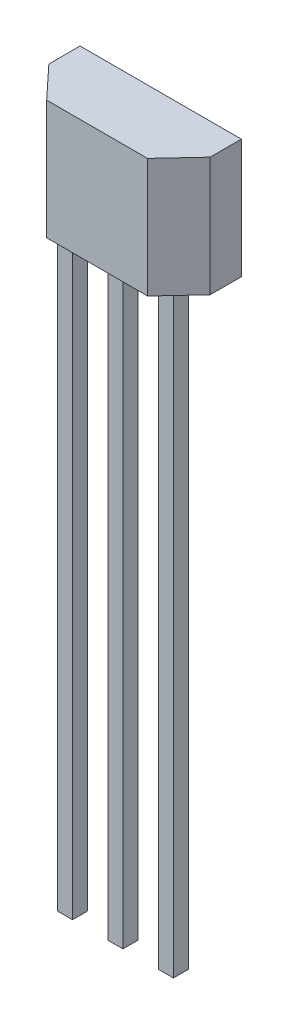
ISO-10303-21;
HEADER;
FILE_DESCRIPTION(('STEP AP214'),'2;1');
FILE_NAME('part.step','',(''),(''),'','','');
FILE_SCHEMA(('AUTOMOTIVE_DESIGN { 1 0 10303 214 1 1 1 1 }'));
ENDSEC;
DATA;
#1=APPLICATION_CONTEXT('core data for automotive mechanical design processes');
#2=APPLICATION_PROTOCOL_DEFINITION('international standard','automotive_design',2000,#1);
#3=PRODUCT_CONTEXT('',#1,'mechanical');
#4=PRODUCT('Part','Part','',(#3));
#5=PRODUCT_RELATED_PRODUCT_CATEGORY('part','',(#4));
#6=PRODUCT_DEFINITION_FORMATION('','',#4);
#7=PRODUCT_DEFINITION_CONTEXT('part definition',#1,'design');
#8=PRODUCT_DEFINITION('design','',#6,#7);
#9=PRODUCT_DEFINITION_SHAPE('','',#8);
#10=(LENGTH_UNIT() NAMED_UNIT(*) SI_UNIT(.MILLI.,.METRE.));
#11=(NAMED_UNIT(*) PLANE_ANGLE_UNIT() SI_UNIT($,.RADIAN.));
#12=(NAMED_UNIT(*) SI_UNIT($,.STERADIAN.) SOLID_ANGLE_UNIT());
#13=UNCERTAINTY_MEASURE_WITH_UNIT(LENGTH_MEASURE(1.E-05),#10,'distance_accuracy_value','');
#14=(GEOMETRIC_REPRESENTATION_CONTEXT(3) GLOBAL_UNCERTAINTY_ASSIGNED_CONTEXT((#13)) GLOBAL_UNIT_ASSIGNED_CONTEXT((#10,
#11,#12)) REPRESENTATION_CONTEXT('',''));
#15=CARTESIAN_POINT('',(0.,0.,0.));
#16=DIRECTION('',(0.,0.,1.));
#17=DIRECTION('',(1.,0.,0.));
#18=AXIS2_PLACEMENT_3D('',#15,#16,#17);
#19=CARTESIAN_POINT('',(0.,-3.,0.));
#20=DIRECTION('',(0.,1.,0.));
#21=DIRECTION('',(0.,0.,1.));
#22=AXIS2_PLACEMENT_3D('',#19,#20,#21);
#23=PLANE('',#22);
#24=DIRECTION('',(0.,0.,-1.));
#25=VECTOR('',#24,1.);
#26=CARTESIAN_POINT('',(-0.19,-3.,1.14));
#27=LINE('',#26,#25);
#28=CARTESIAN_POINT('',(-0.19,-3.,1.14));
#29=VERTEX_POINT('',#28);
#30=CARTESIAN_POINT('',(-0.19,-3.,0.76));
#31=VERTEX_POINT('',#30);
#32=EDGE_CURVE('E180',#29,#31,#27,.T.);
#33=ORIENTED_EDGE('',*,*,#32,.F.);
#34=DIRECTION('',(-1.,0.,0.));
#35=VECTOR('',#34,1.);
#36=CARTESIAN_POINT('',(-0.19,-3.,1.14));
#37=LINE('',#36,#35);
#38=CARTESIAN_POINT('',(0.19,-3.,1.14));
#39=VERTEX_POINT('',#38);
#40=EDGE_CURVE('E193',#39,#29,#37,.T.);
#41=ORIENTED_EDGE('',*,*,#40,.F.);
#42=DIRECTION('',(0.,0.,1.));
#43=VECTOR('',#42,1.);
#44=CARTESIAN_POINT('',(0.19,-3.,1.14));
#45=LINE('',#44,#43);
#46=CARTESIAN_POINT('',(0.19,-3.,0.76));
#47=VERTEX_POINT('',#46);
#48=EDGE_CURVE('E202',#47,#39,#45,.T.);
#49=ORIENTED_EDGE('',*,*,#48,.F.);
#50=DIRECTION('',(1.,0.,0.));
#51=VECTOR('',#50,1.);
#52=CARTESIAN_POINT('',(-0.19,-3.,0.76));
#53=LINE('',#52,#51);
#54=EDGE_CURVE('E183',#31,#47,#53,.T.);
#55=ORIENTED_EDGE('',*,*,#54,.F.);
#56=EDGE_LOOP('',(#33,#41,#49,#55));
#57=FACE_BOUND('',#56,.T.);
#58=DIRECTION('',(0.,0.,1.));
#59=VECTOR('',#58,1.);
#60=CARTESIAN_POINT('',(-2.03,-3.,0.));
#61=LINE('',#60,#59);
#62=CARTESIAN_POINT('',(-2.03,-3.,0.));
#63=VERTEX_POINT('',#62);
#64=CARTESIAN_POINT('',(-2.03,-3.,0.784999780381239));
#65=VERTEX_POINT('',#64);
#66=EDGE_CURVE('E252',#63,#65,#61,.T.);
#67=ORIENTED_EDGE('',*,*,#66,.F.);
#68=DIRECTION('',(-1.,0.,0.));
#69=VECTOR('',#68,1.);
#70=CARTESIAN_POINT('',(-2.03,-3.,0.));
#71=LINE('',#70,#69);
#72=CARTESIAN_POINT('',(2.03,-3.,0.));
#73=VERTEX_POINT('',#72);
#74=EDGE_CURVE('E268',#73,#63,#71,.T.);
#75=ORIENTED_EDGE('',*,*,#74,.F.);
#76=DIRECTION('',(0.,0.,-1.));
#77=VECTOR('',#76,1.);
#78=CARTESIAN_POINT('',(2.03,-3.,0.784999780381239));
#79=LINE('',#78,#77);
#80=CARTESIAN_POINT('',(2.03,-3.,0.784999780381239));
#81=VERTEX_POINT('',#80);
#82=EDGE_CURVE('E265',#81,#73,#79,.T.);
#83=ORIENTED_EDGE('',*,*,#82,.F.);
#84=DIRECTION('',(0.681998360062497,0.,-0.731353701619172));
#85=VECTOR('',#84,1.);
#86=CARTESIAN_POINT('',(1.27,-3.,1.6));
#87=LINE('',#86,#85);
#88=CARTESIAN_POINT('',(1.27,-3.,1.6));
#89=VERTEX_POINT('',#88);
#90=EDGE_CURVE('E262',#89,#81,#87,.T.);
#91=ORIENTED_EDGE('',*,*,#90,.F.);
#92=DIRECTION('',(1.,0.,0.));
#93=VECTOR('',#92,1.);
#94=CARTESIAN_POINT('',(-1.27,-3.,1.6));
#95=LINE('',#94,#93);
#96=CARTESIAN_POINT('',(-1.27,-3.,1.6));
#97=VERTEX_POINT('',#96);
#98=EDGE_CURVE('E259',#97,#89,#95,.T.);
#99=ORIENTED_EDGE('',*,*,#98,.F.);
#100=DIRECTION('',(0.681998360062497,0.,0.731353701619172));
#101=VECTOR('',#100,1.);
#102=CARTESIAN_POINT('',(-2.03,-3.,0.784999780381239));
#103=LINE('',#102,#101);
#104=EDGE_CURVE('E255',#65,#97,#103,.T.);
#105=ORIENTED_EDGE('',*,*,#104,.F.);
#106=EDGE_LOOP('',(#67,#75,#83,#91,#99,#105));
#107=FACE_BOUND('',#106,.T.);
#108=DIRECTION('',(0.,0.,-1.));
#109=VECTOR('',#108,1.);
#110=CARTESIAN_POINT('',(-1.46,-3.,1.14));
#111=LINE('',#110,#109);
#112=CARTESIAN_POINT('',(-1.46,-3.,1.14));
#113=VERTEX_POINT('',#112);
#114=CARTESIAN_POINT('',(-1.46,-3.,0.76));
#115=VERTEX_POINT('',#114);
#116=EDGE_CURVE('E218',#113,#115,#111,.T.);
#117=ORIENTED_EDGE('',*,*,#116,.F.);
#118=DIRECTION('',(-1.,0.,0.));
#119=VECTOR('',#118,1.);
#120=CARTESIAN_POINT('',(-1.46,-3.,1.14));
#121=LINE('',#120,#119);
#122=CARTESIAN_POINT('',(-1.08,-3.,1.14));
#123=VERTEX_POINT('',#122);
#124=EDGE_CURVE('E223',#123,#113,#121,.T.);
#125=ORIENTED_EDGE('',*,*,#124,.F.);
#126=DIRECTION('',(0.,0.,1.));
#127=VECTOR('',#126,1.);
#128=CARTESIAN_POINT('',(-1.08,-3.,1.14));
#129=LINE('',#128,#127);
#130=CARTESIAN_POINT('',(-1.08,-3.,0.76));
#131=VERTEX_POINT('',#130);
#132=EDGE_CURVE('E235',#131,#123,#129,.T.);
#133=ORIENTED_EDGE('',*,*,#132,.F.);
#134=DIRECTION('',(1.,0.,0.));
#135=VECTOR('',#134,1.);
#136=CARTESIAN_POINT('',(-1.46,-3.,0.76));
#137=LINE('',#136,#135);
#138=EDGE_CURVE('E232',#115,#131,#137,.T.);
#139=ORIENTED_EDGE('',*,*,#138,.F.);
#140=EDGE_LOOP('',(#117,#125,#133,#139));
#141=FACE_BOUND('',#140,.T.);
#142=DIRECTION('',(0.,0.,-1.));
#143=VECTOR('',#142,1.);
#144=CARTESIAN_POINT('',(1.08,-3.,1.14));
#145=LINE('',#144,#143);
#146=CARTESIAN_POINT('',(1.08,-3.,1.14));
#147=VERTEX_POINT('',#146);
#148=CARTESIAN_POINT('',(1.08,-3.,0.76));
#149=VERTEX_POINT('',#148);
#150=EDGE_CURVE('E179',#147,#149,#145,.T.);
#151=ORIENTED_EDGE('',*,*,#150,.F.);
#152=DIRECTION('',(-1.,0.,0.));
#153=VECTOR('',#152,1.);
#154=CARTESIAN_POINT('',(1.08,-3.,1.14));
#155=LINE('',#154,#153);
#156=CARTESIAN_POINT('',(1.46,-3.,1.14));
#157=VERTEX_POINT('',#156);
#158=EDGE_CURVE('E176',#157,#147,#155,.T.);
#159=ORIENTED_EDGE('',*,*,#158,.F.);
#160=DIRECTION('',(0.,0.,1.));
#161=VECTOR('',#160,1.);
#162=CARTESIAN_POINT('',(1.46,-3.,1.14));
#163=LINE('',#162,#161);
#164=CARTESIAN_POINT('',(1.46,-3.,0.76));
#165=VERTEX_POINT('',#164);
#166=EDGE_CURVE('E55',#165,#157,#163,.T.);
#167=ORIENTED_EDGE('',*,*,#166,.F.);
#168=DIRECTION('',(1.,0.,0.));
#169=VECTOR('',#168,1.);
#170=CARTESIAN_POINT('',(1.08,-3.,0.76));
#171=LINE('',#170,#169);
#172=EDGE_CURVE('E50',#149,#165,#171,.T.);
#173=ORIENTED_EDGE('',*,*,#172,.F.);
#174=EDGE_LOOP('',(#151,#159,#167,#173));
#175=FACE_BOUND('',#174,.T.);
#176=ADVANCED_FACE('F33',(#57,#107,#141,#175),#23,.F.);
#177=CARTESIAN_POINT('',(-2.03,-3.,0.));
#178=DIRECTION('',(-1.,0.,0.));
#179=DIRECTION('',(0.,0.,1.));
#180=AXIS2_PLACEMENT_3D('',#177,#178,#179);
#181=PLANE('',#180);
#182=DIRECTION('',(0.,0.,1.));
#183=VECTOR('',#182,1.);
#184=CARTESIAN_POINT('',(-2.03,0.,0.));
#185=LINE('',#184,#183);
#186=CARTESIAN_POINT('',(-2.03,0.,0.));
#187=VERTEX_POINT('',#186);
#188=CARTESIAN_POINT('',(-2.03,0.,0.784999780381239));
#189=VERTEX_POINT('',#188);
#190=EDGE_CURVE('E251',#187,#189,#185,.T.);
#191=ORIENTED_EDGE('',*,*,#190,.F.);
#192=DIRECTION('',(0.,1.,0.));
#193=VECTOR('',#192,1.);
#194=CARTESIAN_POINT('',(-2.03,-3.,0.));
#195=LINE('',#194,#193);
#196=EDGE_CURVE('E11',#63,#187,#195,.T.);
#197=ORIENTED_EDGE('',*,*,#196,.F.);
#198=ORIENTED_EDGE('',*,*,#66,.T.);
#199=DIRECTION('',(0.,1.,0.));
#200=VECTOR('',#199,1.);
#201=CARTESIAN_POINT('',(-2.03,-3.,0.784999780381239));
#202=LINE('',#201,#200);
#203=EDGE_CURVE('E37',#65,#189,#202,.T.);
#204=ORIENTED_EDGE('',*,*,#203,.T.);
#205=EDGE_LOOP('',(#191,#197,#198,#204));
#206=FACE_BOUND('',#205,.T.);
#207=ADVANCED_FACE('F35',(#206),#181,.T.);
#208=CARTESIAN_POINT('',(-2.03,-3.,0.));
#209=DIRECTION('',(0.,0.,-1.));
#210=DIRECTION('',(-1.,0.,0.));
#211=AXIS2_PLACEMENT_3D('',#208,#209,#210);
#212=PLANE('',#211);
#213=DIRECTION('',(-1.,0.,0.));
#214=VECTOR('',#213,1.);
#215=CARTESIAN_POINT('',(-2.03,0.,0.));
#216=LINE('',#215,#214);
#217=CARTESIAN_POINT('',(2.03,0.,0.));
#218=VERTEX_POINT('',#217);
#219=EDGE_CURVE('E256',#218,#187,#216,.T.);
#220=ORIENTED_EDGE('',*,*,#219,.F.);
#221=DIRECTION('',(0.,1.,0.));
#222=VECTOR('',#221,1.);
#223=CARTESIAN_POINT('',(2.03,-3.,0.));
#224=LINE('',#223,#222);
#225=EDGE_CURVE('E42',#73,#218,#224,.T.);
#226=ORIENTED_EDGE('',*,*,#225,.F.);
#227=ORIENTED_EDGE('',*,*,#74,.T.);
#228=ORIENTED_EDGE('',*,*,#196,.T.);
#229=EDGE_LOOP('',(#220,#226,#227,#228));
#230=FACE_BOUND('',#229,.T.);
#231=ADVANCED_FACE('F305',(#230),#212,.T.);
#232=CARTESIAN_POINT('',(2.03,-3.,0.784999780381239));
#233=DIRECTION('',(1.,0.,0.));
#234=DIRECTION('',(0.,0.,-1.));
#235=AXIS2_PLACEMENT_3D('',#232,#233,#234);
#236=PLANE('',#235);
#237=DIRECTION('',(0.,0.,-1.));
#238=VECTOR('',#237,1.);
#239=CARTESIAN_POINT('',(2.03,0.,0.784999780381239));
#240=LINE('',#239,#238);
#241=CARTESIAN_POINT('',(2.03,0.,0.784999780381239));
#242=VERTEX_POINT('',#241);
#243=EDGE_CURVE('E282',#242,#218,#240,.T.);
#244=ORIENTED_EDGE('',*,*,#243,.F.);
#245=DIRECTION('',(0.,1.,0.));
#246=VECTOR('',#245,1.);
#247=CARTESIAN_POINT('',(2.03,-3.,0.784999780381239));
#248=LINE('',#247,#246);
#249=EDGE_CURVE('E288',#81,#242,#248,.T.);
#250=ORIENTED_EDGE('',*,*,#249,.F.);
#251=ORIENTED_EDGE('',*,*,#82,.T.);
#252=ORIENTED_EDGE('',*,*,#225,.T.);
#253=EDGE_LOOP('',(#244,#250,#251,#252));
#254=FACE_BOUND('',#253,.T.);
#255=ADVANCED_FACE('F318',(#254),#236,.T.);
#256=CARTESIAN_POINT('',(1.27,-3.,1.6));
#257=DIRECTION('',(0.731353701619172,0.,0.681998360062497));
#258=DIRECTION('',(0.681998360062497,0.,-0.731353701619172));
#259=AXIS2_PLACEMENT_3D('',#256,#257,#258);
#260=PLANE('',#259);
#261=DIRECTION('',(0.681998360062497,0.,-0.731353701619172));
#262=VECTOR('',#261,1.);
#263=CARTESIAN_POINT('',(1.27,0.,1.6));
#264=LINE('',#263,#262);
#265=CARTESIAN_POINT('',(1.27,0.,1.6));
#266=VERTEX_POINT('',#265);
#267=EDGE_CURVE('E279',#266,#242,#264,.T.);
#268=ORIENTED_EDGE('',*,*,#267,.F.);
#269=DIRECTION('',(0.,1.,0.));
#270=VECTOR('',#269,1.);
#271=CARTESIAN_POINT('',(1.27,-3.,1.6));
#272=LINE('',#271,#270);
#273=EDGE_CURVE('E290',#89,#266,#272,.T.);
#274=ORIENTED_EDGE('',*,*,#273,.F.);
#275=ORIENTED_EDGE('',*,*,#90,.T.);
#276=ORIENTED_EDGE('',*,*,#249,.T.);
#277=EDGE_LOOP('',(#268,#274,#275,#276));
#278=FACE_BOUND('',#277,.T.);
#279=ADVANCED_FACE('F316',(#278),#260,.T.);
#280=CARTESIAN_POINT('',(-1.27,-3.,1.6));
#281=DIRECTION('',(0.,0.,1.));
#282=DIRECTION('',(1.,0.,0.));
#283=AXIS2_PLACEMENT_3D('',#280,#281,#282);
#284=PLANE('',#283);
#285=DIRECTION('',(1.,0.,0.));
#286=VECTOR('',#285,1.);
#287=CARTESIAN_POINT('',(-1.27,0.,1.6));
#288=LINE('',#287,#286);
#289=CARTESIAN_POINT('',(-1.27,0.,1.6));
#290=VERTEX_POINT('',#289);
#291=EDGE_CURVE('E276',#290,#266,#288,.T.);
#292=ORIENTED_EDGE('',*,*,#291,.F.);
#293=DIRECTION('',(0.,1.,0.));
#294=VECTOR('',#293,1.);
#295=CARTESIAN_POINT('',(-1.27,-3.,1.6));
#296=LINE('',#295,#294);
#297=EDGE_CURVE('E291',#97,#290,#296,.T.);
#298=ORIENTED_EDGE('',*,*,#297,.F.);
#299=ORIENTED_EDGE('',*,*,#98,.T.);
#300=ORIENTED_EDGE('',*,*,#273,.T.);
#301=EDGE_LOOP('',(#292,#298,#299,#300));
#302=FACE_BOUND('',#301,.T.);
#303=ADVANCED_FACE('F313',(#302),#284,.T.);
#304=CARTESIAN_POINT('',(-2.03,-3.,0.784999780381239));
#305=DIRECTION('',(-0.731353701619172,0.,0.681998360062497));
#306=DIRECTION('',(0.681998360062497,0.,0.731353701619172));
#307=AXIS2_PLACEMENT_3D('',#304,#305,#306);
#308=PLANE('',#307);
#309=DIRECTION('',(0.681998360062497,0.,0.731353701619172));
#310=VECTOR('',#309,1.);
#311=CARTESIAN_POINT('',(-2.03,0.,0.784999780381239));
#312=LINE('',#311,#310);
#313=EDGE_CURVE('E273',#189,#290,#312,.T.);
#314=ORIENTED_EDGE('',*,*,#313,.F.);
#315=ORIENTED_EDGE('',*,*,#203,.F.);
#316=ORIENTED_EDGE('',*,*,#104,.T.);
#317=ORIENTED_EDGE('',*,*,#297,.T.);
#318=EDGE_LOOP('',(#314,#315,#316,#317));
#319=FACE_BOUND('',#318,.T.);
#320=ADVANCED_FACE('F299',(#319),#308,.T.);
#321=CARTESIAN_POINT('',(0.,0.,0.));
#322=DIRECTION('',(0.,1.,0.));
#323=DIRECTION('',(0.,0.,1.));
#324=AXIS2_PLACEMENT_3D('',#321,#322,#323);
#325=PLANE('',#324);
#326=ORIENTED_EDGE('',*,*,#190,.T.);
#327=ORIENTED_EDGE('',*,*,#313,.T.);
#328=ORIENTED_EDGE('',*,*,#291,.T.);
#329=ORIENTED_EDGE('',*,*,#267,.T.);
#330=ORIENTED_EDGE('',*,*,#243,.T.);
#331=ORIENTED_EDGE('',*,*,#219,.T.);
#332=EDGE_LOOP('',(#326,#327,#328,#329,#330,#331));
#333=FACE_BOUND('',#332,.T.);
#334=ADVANCED_FACE('F301',(#333),#325,.T.);
#335=CARTESIAN_POINT('',(-1.46,-18.,1.14));
#336=DIRECTION('',(1.,0.,0.));
#337=DIRECTION('',(0.,0.,-1.));
#338=AXIS2_PLACEMENT_3D('',#335,#336,#337);
#339=PLANE('',#338);
#340=ORIENTED_EDGE('',*,*,#116,.T.);
#341=DIRECTION('',(0.,1.,0.));
#342=VECTOR('',#341,1.);
#343=CARTESIAN_POINT('',(-1.46,-18.,0.76));
#344=LINE('',#343,#342);
#345=CARTESIAN_POINT('',(-1.46,-18.,0.76));
#346=VERTEX_POINT('',#345);
#347=EDGE_CURVE('E248',#346,#115,#344,.T.);
#348=ORIENTED_EDGE('',*,*,#347,.F.);
#349=DIRECTION('',(0.,0.,-1.));
#350=VECTOR('',#349,1.);
#351=CARTESIAN_POINT('',(-1.46,-18.,1.14));
#352=LINE('',#351,#350);
#353=CARTESIAN_POINT('',(-1.46,-18.,1.14));
#354=VERTEX_POINT('',#353);
#355=EDGE_CURVE('E219',#354,#346,#352,.T.);
#356=ORIENTED_EDGE('',*,*,#355,.F.);
#357=DIRECTION('',(0.,1.,0.));
#358=VECTOR('',#357,1.);
#359=CARTESIAN_POINT('',(-1.46,-18.,1.14));
#360=LINE('',#359,#358);
#361=EDGE_CURVE('E229',#354,#113,#360,.T.);
#362=ORIENTED_EDGE('',*,*,#361,.T.);
#363=EDGE_LOOP('',(#340,#348,#356,#362));
#364=FACE_BOUND('',#363,.T.);
#365=ADVANCED_FACE('F335',(#364),#339,.F.);
#366=CARTESIAN_POINT('',(-1.46,-18.,0.76));
#367=DIRECTION('',(0.,0.,1.));
#368=DIRECTION('',(1.,0.,0.));
#369=AXIS2_PLACEMENT_3D('',#366,#367,#368);
#370=PLANE('',#369);
#371=ORIENTED_EDGE('',*,*,#138,.T.);
#372=DIRECTION('',(0.,1.,0.));
#373=VECTOR('',#372,1.);
#374=CARTESIAN_POINT('',(-1.08,-18.,0.76));
#375=LINE('',#374,#373);
#376=CARTESIAN_POINT('',(-1.08,-18.,0.76));
#377=VERTEX_POINT('',#376);
#378=EDGE_CURVE('E245',#377,#131,#375,.T.);
#379=ORIENTED_EDGE('',*,*,#378,.F.);
#380=DIRECTION('',(1.,0.,0.));
#381=VECTOR('',#380,1.);
#382=CARTESIAN_POINT('',(-1.46,-18.,0.76));
#383=LINE('',#382,#381);
#384=EDGE_CURVE('E222',#346,#377,#383,.T.);
#385=ORIENTED_EDGE('',*,*,#384,.F.);
#386=ORIENTED_EDGE('',*,*,#347,.T.);
#387=EDGE_LOOP('',(#371,#379,#385,#386));
#388=FACE_BOUND('',#387,.T.);
#389=ADVANCED_FACE('F342',(#388),#370,.F.);
#390=CARTESIAN_POINT('',(-1.08,-18.,1.14));
#391=DIRECTION('',(-1.,0.,0.));
#392=DIRECTION('',(0.,0.,1.));
#393=AXIS2_PLACEMENT_3D('',#390,#391,#392);
#394=PLANE('',#393);
#395=ORIENTED_EDGE('',*,*,#132,.T.);
#396=DIRECTION('',(0.,1.,0.));
#397=VECTOR('',#396,1.);
#398=CARTESIAN_POINT('',(-1.08,-18.,1.14));
#399=LINE('',#398,#397);
#400=CARTESIAN_POINT('',(-1.08,-18.,1.14));
#401=VERTEX_POINT('',#400);
#402=EDGE_CURVE('E242',#401,#123,#399,.T.);
#403=ORIENTED_EDGE('',*,*,#402,.F.);
#404=DIRECTION('',(0.,0.,1.));
#405=VECTOR('',#404,1.);
#406=CARTESIAN_POINT('',(-1.08,-18.,1.14));
#407=LINE('',#406,#405);
#408=EDGE_CURVE('E225',#377,#401,#407,.T.);
#409=ORIENTED_EDGE('',*,*,#408,.F.);
#410=ORIENTED_EDGE('',*,*,#378,.T.);
#411=EDGE_LOOP('',(#395,#403,#409,#410));
#412=FACE_BOUND('',#411,.T.);
#413=ADVANCED_FACE('F399',(#412),#394,.F.);
#414=CARTESIAN_POINT('',(-1.46,-18.,1.14));
#415=DIRECTION('',(0.,0.,-1.));
#416=DIRECTION('',(-1.,0.,0.));
#417=AXIS2_PLACEMENT_3D('',#414,#415,#416);
#418=PLANE('',#417);
#419=ORIENTED_EDGE('',*,*,#124,.T.);
#420=ORIENTED_EDGE('',*,*,#361,.F.);
#421=DIRECTION('',(-1.,0.,0.));
#422=VECTOR('',#421,1.);
#423=CARTESIAN_POINT('',(-1.46,-18.,1.14));
#424=LINE('',#423,#422);
#425=EDGE_CURVE('E227',#401,#354,#424,.T.);
#426=ORIENTED_EDGE('',*,*,#425,.F.);
#427=ORIENTED_EDGE('',*,*,#402,.T.);
#428=EDGE_LOOP('',(#419,#420,#426,#427));
#429=FACE_BOUND('',#428,.T.);
#430=ADVANCED_FACE('F407',(#429),#418,.F.);
#431=CARTESIAN_POINT('',(0.,-18.,0.));
#432=DIRECTION('',(0.,-1.,0.));
#433=DIRECTION('',(0.,0.,-1.));
#434=AXIS2_PLACEMENT_3D('',#431,#432,#433);
#435=PLANE('',#434);
#436=ORIENTED_EDGE('',*,*,#355,.T.);
#437=ORIENTED_EDGE('',*,*,#384,.T.);
#438=ORIENTED_EDGE('',*,*,#408,.T.);
#439=ORIENTED_EDGE('',*,*,#425,.T.);
#440=EDGE_LOOP('',(#436,#437,#438,#439));
#441=FACE_BOUND('',#440,.T.);
#442=ADVANCED_FACE('F416',(#441),#435,.T.);
#443=CARTESIAN_POINT('',(-0.19,-18.,1.14));
#444=DIRECTION('',(1.,0.,0.));
#445=DIRECTION('',(0.,0.,-1.));
#446=AXIS2_PLACEMENT_3D('',#443,#444,#445);
#447=PLANE('',#446);
#448=ORIENTED_EDGE('',*,*,#32,.T.);
#449=DIRECTION('',(0.,1.,0.));
#450=VECTOR('',#449,1.);
#451=CARTESIAN_POINT('',(-0.19,-18.,0.76));
#452=LINE('',#451,#450);
#453=CARTESIAN_POINT('',(-0.19,-18.,0.76));
#454=VERTEX_POINT('',#453);
#455=EDGE_CURVE('E215',#454,#31,#452,.T.);
#456=ORIENTED_EDGE('',*,*,#455,.F.);
#457=DIRECTION('',(0.,0.,-1.));
#458=VECTOR('',#457,1.);
#459=CARTESIAN_POINT('',(-0.19,-18.,1.14));
#460=LINE('',#459,#458);
#461=CARTESIAN_POINT('',(-0.19,-18.,1.14));
#462=VERTEX_POINT('',#461);
#463=EDGE_CURVE('E189',#462,#454,#460,.T.);
#464=ORIENTED_EDGE('',*,*,#463,.F.);
#465=DIRECTION('',(0.,1.,0.));
#466=VECTOR('',#465,1.);
#467=CARTESIAN_POINT('',(-0.19,-18.,1.14));
#468=LINE('',#467,#466);
#469=EDGE_CURVE('E198',#462,#29,#468,.T.);
#470=ORIENTED_EDGE('',*,*,#469,.T.);
#471=EDGE_LOOP('',(#448,#456,#464,#470));
#472=FACE_BOUND('',#471,.T.);
#473=ADVANCED_FACE('F425',(#472),#447,.F.);
#474=CARTESIAN_POINT('',(-0.19,-18.,0.76));
#475=DIRECTION('',(0.,0.,1.));
#476=DIRECTION('',(1.,0.,0.));
#477=AXIS2_PLACEMENT_3D('',#474,#475,#476);
#478=PLANE('',#477);
#479=ORIENTED_EDGE('',*,*,#54,.T.);
#480=DIRECTION('',(0.,1.,0.));
#481=VECTOR('',#480,1.);
#482=CARTESIAN_POINT('',(0.19,-18.,0.76));
#483=LINE('',#482,#481);
#484=CARTESIAN_POINT('',(0.19,-18.,0.76));
#485=VERTEX_POINT('',#484);
#486=EDGE_CURVE('E212',#485,#47,#483,.T.);
#487=ORIENTED_EDGE('',*,*,#486,.F.);
#488=DIRECTION('',(1.,0.,0.));
#489=VECTOR('',#488,1.);
#490=CARTESIAN_POINT('',(-0.19,-18.,0.76));
#491=LINE('',#490,#489);
#492=EDGE_CURVE('E192',#454,#485,#491,.T.);
#493=ORIENTED_EDGE('',*,*,#492,.F.);
#494=ORIENTED_EDGE('',*,*,#455,.T.);
#495=EDGE_LOOP('',(#479,#487,#493,#494));
#496=FACE_BOUND('',#495,.T.);
#497=ADVANCED_FACE('F434',(#496),#478,.F.);
#498=CARTESIAN_POINT('',(0.19,-18.,1.14));
#499=DIRECTION('',(-1.,0.,0.));
#500=DIRECTION('',(0.,0.,1.));
#501=AXIS2_PLACEMENT_3D('',#498,#499,#500);
#502=PLANE('',#501);
#503=ORIENTED_EDGE('',*,*,#48,.T.);
#504=DIRECTION('',(0.,1.,0.));
#505=VECTOR('',#504,1.);
#506=CARTESIAN_POINT('',(0.19,-18.,1.14));
#507=LINE('',#506,#505);
#508=CARTESIAN_POINT('',(0.19,-18.,1.14));
#509=VERTEX_POINT('',#508);
#510=EDGE_CURVE('E209',#509,#39,#507,.T.);
#511=ORIENTED_EDGE('',*,*,#510,.F.);
#512=DIRECTION('',(0.,0.,1.));
#513=VECTOR('',#512,1.);
#514=CARTESIAN_POINT('',(0.19,-18.,1.14));
#515=LINE('',#514,#513);
#516=EDGE_CURVE('E195',#485,#509,#515,.T.);
#517=ORIENTED_EDGE('',*,*,#516,.F.);
#518=ORIENTED_EDGE('',*,*,#486,.T.);
#519=EDGE_LOOP('',(#503,#511,#517,#518));
#520=FACE_BOUND('',#519,.T.);
#521=ADVANCED_FACE('F443',(#520),#502,.F.);
#522=CARTESIAN_POINT('',(-0.19,-18.,1.14));
#523=DIRECTION('',(0.,0.,-1.));
#524=DIRECTION('',(-1.,0.,0.));
#525=AXIS2_PLACEMENT_3D('',#522,#523,#524);
#526=PLANE('',#525);
#527=ORIENTED_EDGE('',*,*,#40,.T.);
#528=ORIENTED_EDGE('',*,*,#469,.F.);
#529=DIRECTION('',(-1.,0.,0.));
#530=VECTOR('',#529,1.);
#531=CARTESIAN_POINT('',(-0.19,-18.,1.14));
#532=LINE('',#531,#530);
#533=EDGE_CURVE('E197',#509,#462,#532,.T.);
#534=ORIENTED_EDGE('',*,*,#533,.F.);
#535=ORIENTED_EDGE('',*,*,#510,.T.);
#536=EDGE_LOOP('',(#527,#528,#534,#535));
#537=FACE_BOUND('',#536,.T.);
#538=ADVANCED_FACE('F452',(#537),#526,.F.);
#539=CARTESIAN_POINT('',(0.,-18.,0.));
#540=DIRECTION('',(0.,-1.,0.));
#541=DIRECTION('',(0.,0.,-1.));
#542=AXIS2_PLACEMENT_3D('',#539,#540,#541);
#543=PLANE('',#542);
#544=ORIENTED_EDGE('',*,*,#463,.T.);
#545=ORIENTED_EDGE('',*,*,#492,.T.);
#546=ORIENTED_EDGE('',*,*,#516,.T.);
#547=ORIENTED_EDGE('',*,*,#533,.T.);
#548=EDGE_LOOP('',(#544,#545,#546,#547));
#549=FACE_BOUND('',#548,.T.);
#550=ADVANCED_FACE('F461',(#549),#543,.T.);
#551=CARTESIAN_POINT('',(1.08,-18.,1.14));
#552=DIRECTION('',(1.,0.,0.));
#553=DIRECTION('',(0.,0.,-1.));
#554=AXIS2_PLACEMENT_3D('',#551,#552,#553);
#555=PLANE('',#554);
#556=ORIENTED_EDGE('',*,*,#150,.T.);
#557=DIRECTION('',(0.,1.,0.));
#558=VECTOR('',#557,1.);
#559=CARTESIAN_POINT('',(1.08,-18.,0.76));
#560=LINE('',#559,#558);
#561=CARTESIAN_POINT('',(1.08,-18.,0.76));
#562=VERTEX_POINT('',#561);
#563=EDGE_CURVE('E160',#562,#149,#560,.T.);
#564=ORIENTED_EDGE('',*,*,#563,.F.);
#565=DIRECTION('',(0.,0.,-1.));
#566=VECTOR('',#565,1.);
#567=CARTESIAN_POINT('',(1.08,-18.,1.14));
#568=LINE('',#567,#566);
#569=CARTESIAN_POINT('',(1.08,-18.,1.14));
#570=VERTEX_POINT('',#569);
#571=EDGE_CURVE('E167',#570,#562,#568,.T.);
#572=ORIENTED_EDGE('',*,*,#571,.F.);
#573=DIRECTION('',(0.,1.,0.));
#574=VECTOR('',#573,1.);
#575=CARTESIAN_POINT('',(1.08,-18.,1.14));
#576=LINE('',#575,#574);
#577=EDGE_CURVE('E528',#570,#147,#576,.T.);
#578=ORIENTED_EDGE('',*,*,#577,.T.);
#579=EDGE_LOOP('',(#556,#564,#572,#578));
#580=FACE_BOUND('',#579,.T.);
#581=ADVANCED_FACE('F178',(#580),#555,.F.);
#582=CARTESIAN_POINT('',(1.08,-18.,0.76));
#583=DIRECTION('',(0.,0.,1.));
#584=DIRECTION('',(1.,0.,0.));
#585=AXIS2_PLACEMENT_3D('',#582,#583,#584);
#586=PLANE('',#585);
#587=ORIENTED_EDGE('',*,*,#172,.T.);
#588=DIRECTION('',(0.,1.,0.));
#589=VECTOR('',#588,1.);
#590=CARTESIAN_POINT('',(1.46,-18.,0.76));
#591=LINE('',#590,#589);
#592=CARTESIAN_POINT('',(1.46,-18.,0.76));
#593=VERTEX_POINT('',#592);
#594=EDGE_CURVE('E163',#593,#165,#591,.T.);
#595=ORIENTED_EDGE('',*,*,#594,.F.);
#596=DIRECTION('',(1.,0.,0.));
#597=VECTOR('',#596,1.);
#598=CARTESIAN_POINT('',(1.08,-18.,0.76));
#599=LINE('',#598,#597);
#600=EDGE_CURVE('E156',#562,#593,#599,.T.);
#601=ORIENTED_EDGE('',*,*,#600,.F.);
#602=ORIENTED_EDGE('',*,*,#563,.T.);
#603=EDGE_LOOP('',(#587,#595,#601,#602));
#604=FACE_BOUND('',#603,.T.);
#605=ADVANCED_FACE('F158',(#604),#586,.F.);
#606=CARTESIAN_POINT('',(1.46,-18.,1.14));
#607=DIRECTION('',(-1.,0.,0.));
#608=DIRECTION('',(0.,0.,1.));
#609=AXIS2_PLACEMENT_3D('',#606,#607,#608);
#610=PLANE('',#609);
#611=ORIENTED_EDGE('',*,*,#166,.T.);
#612=DIRECTION('',(0.,1.,0.));
#613=VECTOR('',#612,1.);
#614=CARTESIAN_POINT('',(1.46,-18.,1.14));
#615=LINE('',#614,#613);
#616=CARTESIAN_POINT('',(1.46,-18.,1.14));
#617=VERTEX_POINT('',#616);
#618=EDGE_CURVE('E185',#617,#157,#615,.T.);
#619=ORIENTED_EDGE('',*,*,#618,.F.);
#620=DIRECTION('',(0.,0.,1.));
#621=VECTOR('',#620,1.);
#622=CARTESIAN_POINT('',(1.46,-18.,1.14));
#623=LINE('',#622,#621);
#624=EDGE_CURVE('E166',#593,#617,#623,.T.);
#625=ORIENTED_EDGE('',*,*,#624,.F.);
#626=ORIENTED_EDGE('',*,*,#594,.T.);
#627=EDGE_LOOP('',(#611,#619,#625,#626));
#628=FACE_BOUND('',#627,.T.);
#629=ADVANCED_FACE('F485',(#628),#610,.F.);
#630=CARTESIAN_POINT('',(1.08,-18.,1.14));
#631=DIRECTION('',(0.,0.,-1.));
#632=DIRECTION('',(-1.,0.,0.));
#633=AXIS2_PLACEMENT_3D('',#630,#631,#632);
#634=PLANE('',#633);
#635=ORIENTED_EDGE('',*,*,#158,.T.);
#636=ORIENTED_EDGE('',*,*,#577,.F.);
#637=DIRECTION('',(-1.,0.,0.));
#638=VECTOR('',#637,1.);
#639=CARTESIAN_POINT('',(1.08,-18.,1.14));
#640=LINE('',#639,#638);
#641=EDGE_CURVE('E172',#617,#570,#640,.T.);
#642=ORIENTED_EDGE('',*,*,#641,.F.);
#643=ORIENTED_EDGE('',*,*,#618,.T.);
#644=EDGE_LOOP('',(#635,#636,#642,#643));
#645=FACE_BOUND('',#644,.T.);
#646=ADVANCED_FACE('F493',(#645),#634,.F.);
#647=CARTESIAN_POINT('',(0.,-18.,0.));
#648=DIRECTION('',(0.,-1.,0.));
#649=DIRECTION('',(0.,0.,-1.));
#650=AXIS2_PLACEMENT_3D('',#647,#648,#649);
#651=PLANE('',#650);
#652=ORIENTED_EDGE('',*,*,#571,.T.);
#653=ORIENTED_EDGE('',*,*,#600,.T.);
#654=ORIENTED_EDGE('',*,*,#624,.T.);
#655=ORIENTED_EDGE('',*,*,#641,.T.);
#656=EDGE_LOOP('',(#652,#653,#654,#655));
#657=FACE_BOUND('',#656,.T.);
#658=ADVANCED_FACE('F170',(#657),#651,.T.);
#659=CLOSED_SHELL('',(#176,#207,#231,#255,#279,#303,#320,#334,#365,#389,#413,#430,#442,#473,
#497,#521,#538,#550,#581,#605,#629,#646,#658));
#660=MANIFOLD_SOLID_BREP('B2',#659);
#661=ADVANCED_BREP_SHAPE_REPRESENTATION('',(#18,#660),#14);
#662=SHAPE_DEFINITION_REPRESENTATION(#9,#661);
ENDSEC;
END-ISO-10303-21;
